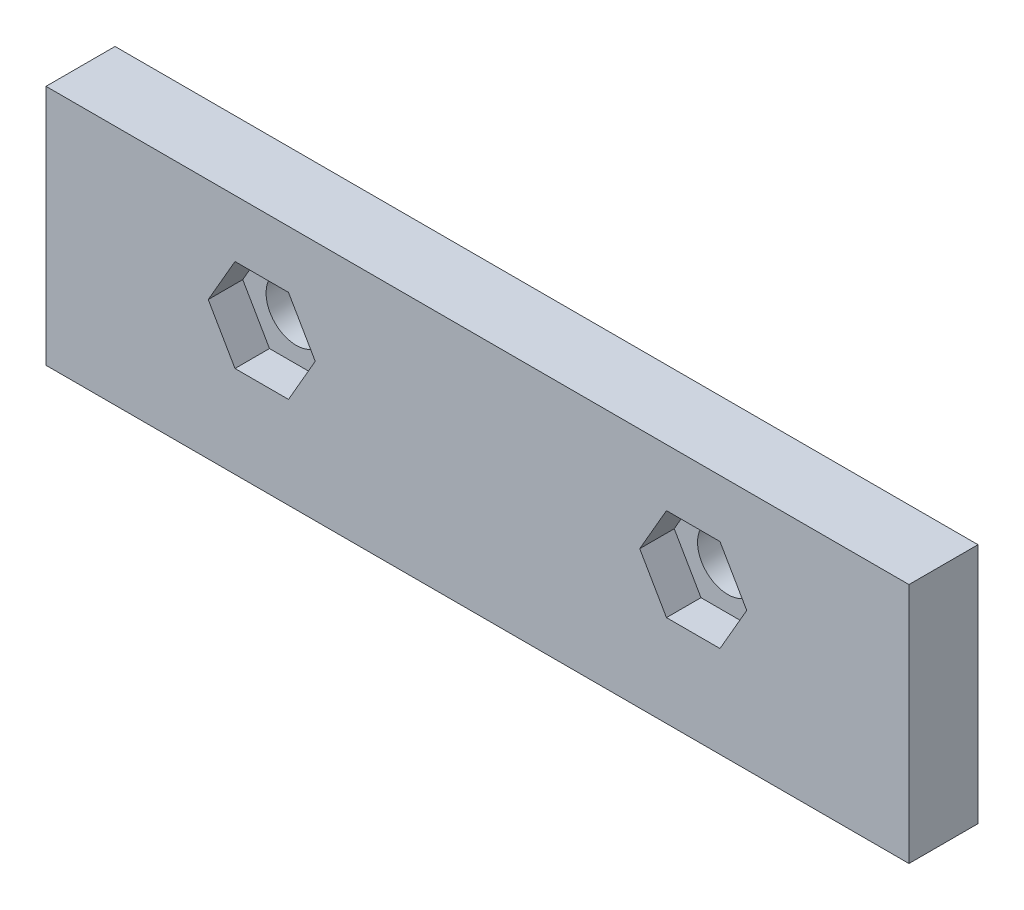
ISO-10303-21;
HEADER;
FILE_DESCRIPTION(('STEP AP214'),'2;1');
FILE_NAME('part.step','',(''),(''),'','','');
FILE_SCHEMA(('AUTOMOTIVE_DESIGN { 1 0 10303 214 1 1 1 1 }'));
ENDSEC;
DATA;
#1=APPLICATION_CONTEXT('core data for automotive mechanical design processes');
#2=APPLICATION_PROTOCOL_DEFINITION('international standard','automotive_design',2000,#1);
#3=PRODUCT_CONTEXT('',#1,'mechanical');
#4=PRODUCT('Part','Part','',(#3));
#5=PRODUCT_RELATED_PRODUCT_CATEGORY('part','',(#4));
#6=PRODUCT_DEFINITION_FORMATION('','',#4);
#7=PRODUCT_DEFINITION_CONTEXT('part definition',#1,'design');
#8=PRODUCT_DEFINITION('design','',#6,#7);
#9=PRODUCT_DEFINITION_SHAPE('','',#8);
#10=(LENGTH_UNIT() NAMED_UNIT(*) SI_UNIT(.MILLI.,.METRE.));
#11=(NAMED_UNIT(*) PLANE_ANGLE_UNIT() SI_UNIT($,.RADIAN.));
#12=(NAMED_UNIT(*) SI_UNIT($,.STERADIAN.) SOLID_ANGLE_UNIT());
#13=UNCERTAINTY_MEASURE_WITH_UNIT(LENGTH_MEASURE(1.E-05),#10,'distance_accuracy_value','');
#14=(GEOMETRIC_REPRESENTATION_CONTEXT(3) GLOBAL_UNCERTAINTY_ASSIGNED_CONTEXT((#13)) GLOBAL_UNIT_ASSIGNED_CONTEXT((#10,
#11,#12)) REPRESENTATION_CONTEXT('',''));
#15=CARTESIAN_POINT('',(0.,0.,0.));
#16=DIRECTION('',(0.,0.,1.));
#17=DIRECTION('',(1.,0.,0.));
#18=AXIS2_PLACEMENT_3D('',#15,#16,#17);
#19=CARTESIAN_POINT('',(12.5,8.,4.));
#20=DIRECTION('',(0.,0.,-1.));
#21=DIRECTION('',(-1.,0.,0.));
#22=AXIS2_PLACEMENT_3D('',#19,#20,#21);
#23=CYLINDRICAL_SURFACE('',#22,1.75);
#24=CARTESIAN_POINT('',(12.5,8.,0.));
#25=DIRECTION('',(0.,0.,1.));
#26=DIRECTION('',(1.,0.,0.));
#27=AXIS2_PLACEMENT_3D('',#24,#25,#26);
#28=CIRCLE('',#27,1.75);
#29=CARTESIAN_POINT('',(14.25,8.,0.));
#30=VERTEX_POINT('',#29);
#31=EDGE_CURVE('E255',#30,#30,#28,.T.);
#32=ORIENTED_EDGE('',*,*,#31,.F.);
#33=EDGE_LOOP('',(#32));
#34=FACE_BOUND('',#33,.T.);
#35=CARTESIAN_POINT('',(12.5,8.,2.));
#36=DIRECTION('',(0.,0.,1.));
#37=DIRECTION('',(1.,0.,0.));
#38=AXIS2_PLACEMENT_3D('',#35,#36,#37);
#39=CIRCLE('',#38,1.75);
#40=CARTESIAN_POINT('',(14.25,8.,2.));
#41=VERTEX_POINT('',#40);
#42=EDGE_CURVE('E40',#41,#41,#39,.T.);
#43=ORIENTED_EDGE('',*,*,#42,.T.);
#44=EDGE_LOOP('',(#43));
#45=FACE_BOUND('',#44,.T.);
#46=ADVANCED_FACE('F36',(#34,#45),#23,.F.);
#47=CARTESIAN_POINT('',(37.5,8.,4.));
#48=DIRECTION('',(0.,0.,-1.));
#49=DIRECTION('',(-1.,0.,0.));
#50=AXIS2_PLACEMENT_3D('',#47,#48,#49);
#51=CYLINDRICAL_SURFACE('',#50,1.75);
#52=CARTESIAN_POINT('',(37.5,8.,0.));
#53=DIRECTION('',(0.,0.,1.));
#54=DIRECTION('',(1.,0.,0.));
#55=AXIS2_PLACEMENT_3D('',#52,#53,#54);
#56=CIRCLE('',#55,1.75);
#57=CARTESIAN_POINT('',(39.25,8.,0.));
#58=VERTEX_POINT('',#57);
#59=EDGE_CURVE('E252',#58,#58,#56,.T.);
#60=ORIENTED_EDGE('',*,*,#59,.F.);
#61=EDGE_LOOP('',(#60));
#62=FACE_BOUND('',#61,.T.);
#63=CARTESIAN_POINT('',(37.5,8.,2.));
#64=DIRECTION('',(0.,0.,1.));
#65=DIRECTION('',(1.,0.,0.));
#66=AXIS2_PLACEMENT_3D('',#63,#64,#65);
#67=CIRCLE('',#66,1.75);
#68=CARTESIAN_POINT('',(39.25,8.,2.));
#69=VERTEX_POINT('',#68);
#70=EDGE_CURVE('E198',#69,#69,#67,.T.);
#71=ORIENTED_EDGE('',*,*,#70,.T.);
#72=EDGE_LOOP('',(#71));
#73=FACE_BOUND('',#72,.T.);
#74=ADVANCED_FACE('F299',(#62,#73),#51,.F.);
#75=CARTESIAN_POINT('',(0.,0.,4.));
#76=DIRECTION('',(0.,0.,-1.));
#77=DIRECTION('',(-1.,0.,0.));
#78=AXIS2_PLACEMENT_3D('',#75,#76,#77);
#79=PLANE('',#78);
#80=DIRECTION('',(0.5,0.866025403784439,0.));
#81=VECTOR('',#80,1.);
#82=CARTESIAN_POINT('',(14.05,5.31532124826824,4.));
#83=LINE('',#82,#81);
#84=CARTESIAN_POINT('',(14.05,5.31532124826824,4.));
#85=VERTEX_POINT('',#84);
#86=CARTESIAN_POINT('',(15.6,7.99999999999999,4.));
#87=VERTEX_POINT('',#86);
#88=EDGE_CURVE('E186',#85,#87,#83,.T.);
#89=ORIENTED_EDGE('',*,*,#88,.F.);
#90=DIRECTION('',(1.,0.,0.));
#91=VECTOR('',#90,1.);
#92=CARTESIAN_POINT('',(10.95,5.31532124826824,4.));
#93=LINE('',#92,#91);
#94=CARTESIAN_POINT('',(10.95,5.31532124826824,4.));
#95=VERTEX_POINT('',#94);
#96=EDGE_CURVE('E53',#95,#85,#93,.T.);
#97=ORIENTED_EDGE('',*,*,#96,.F.);
#98=DIRECTION('',(0.499999999999999,-0.866025403784439,0.));
#99=VECTOR('',#98,1.);
#100=CARTESIAN_POINT('',(9.40000000000001,8.,4.));
#101=LINE('',#100,#99);
#102=CARTESIAN_POINT('',(9.40000000000001,8.,4.));
#103=VERTEX_POINT('',#102);
#104=EDGE_CURVE('E172',#103,#95,#101,.T.);
#105=ORIENTED_EDGE('',*,*,#104,.F.);
#106=DIRECTION('',(-0.5,-0.866025403784439,0.));
#107=VECTOR('',#106,1.);
#108=CARTESIAN_POINT('',(10.95,10.6846787517318,4.));
#109=LINE('',#108,#107);
#110=CARTESIAN_POINT('',(10.95,10.6846787517318,4.));
#111=VERTEX_POINT('',#110);
#112=EDGE_CURVE('E175',#111,#103,#109,.T.);
#113=ORIENTED_EDGE('',*,*,#112,.F.);
#114=DIRECTION('',(-1.,0.,0.));
#115=VECTOR('',#114,1.);
#116=CARTESIAN_POINT('',(14.05,10.6846787517318,4.));
#117=LINE('',#116,#115);
#118=CARTESIAN_POINT('',(14.05,10.6846787517318,4.));
#119=VERTEX_POINT('',#118);
#120=EDGE_CURVE('E191',#119,#111,#117,.T.);
#121=ORIENTED_EDGE('',*,*,#120,.F.);
#122=DIRECTION('',(-0.499999999999999,0.866025403784439,0.));
#123=VECTOR('',#122,1.);
#124=CARTESIAN_POINT('',(15.6,7.99999999999999,4.));
#125=LINE('',#124,#123);
#126=EDGE_CURVE('E188',#87,#119,#125,.T.);
#127=ORIENTED_EDGE('',*,*,#126,.F.);
#128=EDGE_LOOP('',(#89,#97,#105,#113,#121,#127));
#129=FACE_BOUND('',#128,.T.);
#130=DIRECTION('',(0.499999999999999,0.866025403784439,0.));
#131=VECTOR('',#130,1.);
#132=CARTESIAN_POINT('',(39.05,5.31532124826823,4.));
#133=LINE('',#132,#131);
#134=CARTESIAN_POINT('',(39.05,5.31532124826823,4.));
#135=VERTEX_POINT('',#134);
#136=CARTESIAN_POINT('',(40.6,8.00000000000001,4.));
#137=VERTEX_POINT('',#136);
#138=EDGE_CURVE('E232',#135,#137,#133,.T.);
#139=ORIENTED_EDGE('',*,*,#138,.F.);
#140=DIRECTION('',(1.,0.,0.));
#141=VECTOR('',#140,1.);
#142=CARTESIAN_POINT('',(35.95,5.31532124826823,4.));
#143=LINE('',#142,#141);
#144=CARTESIAN_POINT('',(35.95,5.31532124826823,4.));
#145=VERTEX_POINT('',#144);
#146=EDGE_CURVE('E61',#145,#135,#143,.T.);
#147=ORIENTED_EDGE('',*,*,#146,.F.);
#148=DIRECTION('',(0.5,-0.866025403784439,0.));
#149=VECTOR('',#148,1.);
#150=CARTESIAN_POINT('',(34.4,8.,4.));
#151=LINE('',#150,#149);
#152=CARTESIAN_POINT('',(34.4,8.,4.));
#153=VERTEX_POINT('',#152);
#154=EDGE_CURVE('E219',#153,#145,#151,.T.);
#155=ORIENTED_EDGE('',*,*,#154,.F.);
#156=DIRECTION('',(-0.499999999999999,-0.866025403784439,0.));
#157=VECTOR('',#156,1.);
#158=CARTESIAN_POINT('',(35.95,10.6846787517318,4.));
#159=LINE('',#158,#157);
#160=CARTESIAN_POINT('',(35.95,10.6846787517318,4.));
#161=VERTEX_POINT('',#160);
#162=EDGE_CURVE('E222',#161,#153,#159,.T.);
#163=ORIENTED_EDGE('',*,*,#162,.F.);
#164=DIRECTION('',(-1.,0.,0.));
#165=VECTOR('',#164,1.);
#166=CARTESIAN_POINT('',(39.05,10.6846787517318,4.));
#167=LINE('',#166,#165);
#168=CARTESIAN_POINT('',(39.05,10.6846787517318,4.));
#169=VERTEX_POINT('',#168);
#170=EDGE_CURVE('E226',#169,#161,#167,.T.);
#171=ORIENTED_EDGE('',*,*,#170,.F.);
#172=DIRECTION('',(-0.5,0.866025403784439,0.));
#173=VECTOR('',#172,1.);
#174=CARTESIAN_POINT('',(40.6,8.00000000000001,4.));
#175=LINE('',#174,#173);
#176=EDGE_CURVE('E229',#137,#169,#175,.T.);
#177=ORIENTED_EDGE('',*,*,#176,.F.);
#178=EDGE_LOOP('',(#139,#147,#155,#163,#171,#177));
#179=FACE_BOUND('',#178,.T.);
#180=DIRECTION('',(0.,-1.,0.));
#181=VECTOR('',#180,1.);
#182=CARTESIAN_POINT('',(0.,0.,4.));
#183=LINE('',#182,#181);
#184=CARTESIAN_POINT('',(0.,14.,4.));
#185=VERTEX_POINT('',#184);
#186=CARTESIAN_POINT('',(0.,0.,4.));
#187=VERTEX_POINT('',#186);
#188=EDGE_CURVE('E259',#185,#187,#183,.T.);
#189=ORIENTED_EDGE('',*,*,#188,.T.);
#190=DIRECTION('',(1.,0.,0.));
#191=VECTOR('',#190,1.);
#192=CARTESIAN_POINT('',(0.,0.,4.));
#193=LINE('',#192,#191);
#194=CARTESIAN_POINT('',(50.,0.,4.));
#195=VERTEX_POINT('',#194);
#196=EDGE_CURVE('E262',#187,#195,#193,.T.);
#197=ORIENTED_EDGE('',*,*,#196,.T.);
#198=DIRECTION('',(0.,1.,0.));
#199=VECTOR('',#198,1.);
#200=CARTESIAN_POINT('',(50.,0.,4.));
#201=LINE('',#200,#199);
#202=CARTESIAN_POINT('',(50.,14.,4.));
#203=VERTEX_POINT('',#202);
#204=EDGE_CURVE('E265',#195,#203,#201,.T.);
#205=ORIENTED_EDGE('',*,*,#204,.T.);
#206=DIRECTION('',(-1.,0.,0.));
#207=VECTOR('',#206,1.);
#208=CARTESIAN_POINT('',(0.,14.,4.));
#209=LINE('',#208,#207);
#210=EDGE_CURVE('E267',#203,#185,#209,.T.);
#211=ORIENTED_EDGE('',*,*,#210,.T.);
#212=EDGE_LOOP('',(#189,#197,#205,#211));
#213=FACE_BOUND('',#212,.T.);
#214=ADVANCED_FACE('F305',(#129,#179,#213),#79,.F.);
#215=CARTESIAN_POINT('',(0.,0.,0.));
#216=DIRECTION('',(0.,0.,-1.));
#217=DIRECTION('',(-1.,0.,0.));
#218=AXIS2_PLACEMENT_3D('',#215,#216,#217);
#219=PLANE('',#218);
#220=ORIENTED_EDGE('',*,*,#31,.T.);
#221=EDGE_LOOP('',(#220));
#222=FACE_BOUND('',#221,.T.);
#223=DIRECTION('',(0.,-1.,0.));
#224=VECTOR('',#223,1.);
#225=CARTESIAN_POINT('',(0.,0.,0.));
#226=LINE('',#225,#224);
#227=CARTESIAN_POINT('',(0.,14.,0.));
#228=VERTEX_POINT('',#227);
#229=CARTESIAN_POINT('',(0.,0.,0.));
#230=VERTEX_POINT('',#229);
#231=EDGE_CURVE('E258',#228,#230,#226,.T.);
#232=ORIENTED_EDGE('',*,*,#231,.F.);
#233=DIRECTION('',(-1.,0.,0.));
#234=VECTOR('',#233,1.);
#235=CARTESIAN_POINT('',(0.,14.,0.));
#236=LINE('',#235,#234);
#237=CARTESIAN_POINT('',(50.,14.,0.));
#238=VERTEX_POINT('',#237);
#239=EDGE_CURVE('E263',#238,#228,#236,.T.);
#240=ORIENTED_EDGE('',*,*,#239,.F.);
#241=DIRECTION('',(0.,1.,0.));
#242=VECTOR('',#241,1.);
#243=CARTESIAN_POINT('',(50.,0.,0.));
#244=LINE('',#243,#242);
#245=CARTESIAN_POINT('',(50.,0.,0.));
#246=VERTEX_POINT('',#245);
#247=EDGE_CURVE('E274',#246,#238,#244,.T.);
#248=ORIENTED_EDGE('',*,*,#247,.F.);
#249=DIRECTION('',(1.,0.,0.));
#250=VECTOR('',#249,1.);
#251=CARTESIAN_POINT('',(0.,0.,0.));
#252=LINE('',#251,#250);
#253=EDGE_CURVE('E272',#230,#246,#252,.T.);
#254=ORIENTED_EDGE('',*,*,#253,.F.);
#255=EDGE_LOOP('',(#232,#240,#248,#254));
#256=FACE_BOUND('',#255,.T.);
#257=ORIENTED_EDGE('',*,*,#59,.T.);
#258=EDGE_LOOP('',(#257));
#259=FACE_BOUND('',#258,.T.);
#260=ADVANCED_FACE('F313',(#222,#256,#259),#219,.T.);
#261=CARTESIAN_POINT('',(0.,0.,4.));
#262=DIRECTION('',(1.,0.,0.));
#263=DIRECTION('',(0.,0.,-1.));
#264=AXIS2_PLACEMENT_3D('',#261,#262,#263);
#265=PLANE('',#264);
#266=ORIENTED_EDGE('',*,*,#231,.T.);
#267=DIRECTION('',(0.,0.,-1.));
#268=VECTOR('',#267,1.);
#269=CARTESIAN_POINT('',(0.,0.,4.));
#270=LINE('',#269,#268);
#271=EDGE_CURVE('E11',#187,#230,#270,.T.);
#272=ORIENTED_EDGE('',*,*,#271,.F.);
#273=ORIENTED_EDGE('',*,*,#188,.F.);
#274=DIRECTION('',(0.,0.,-1.));
#275=VECTOR('',#274,1.);
#276=CARTESIAN_POINT('',(0.,14.,4.));
#277=LINE('',#276,#275);
#278=EDGE_CURVE('E269',#185,#228,#277,.T.);
#279=ORIENTED_EDGE('',*,*,#278,.T.);
#280=EDGE_LOOP('',(#266,#272,#273,#279));
#281=FACE_BOUND('',#280,.T.);
#282=ADVANCED_FACE('F38',(#281),#265,.F.);
#283=CARTESIAN_POINT('',(0.,0.,4.));
#284=DIRECTION('',(0.,1.,0.));
#285=DIRECTION('',(0.,0.,1.));
#286=AXIS2_PLACEMENT_3D('',#283,#284,#285);
#287=PLANE('',#286);
#288=ORIENTED_EDGE('',*,*,#253,.T.);
#289=DIRECTION('',(0.,0.,-1.));
#290=VECTOR('',#289,1.);
#291=CARTESIAN_POINT('',(50.,0.,4.));
#292=LINE('',#291,#290);
#293=EDGE_CURVE('E45',#195,#246,#292,.T.);
#294=ORIENTED_EDGE('',*,*,#293,.F.);
#295=ORIENTED_EDGE('',*,*,#196,.F.);
#296=ORIENTED_EDGE('',*,*,#271,.T.);
#297=EDGE_LOOP('',(#288,#294,#295,#296));
#298=FACE_BOUND('',#297,.T.);
#299=ADVANCED_FACE('F325',(#298),#287,.F.);
#300=CARTESIAN_POINT('',(50.,0.,4.));
#301=DIRECTION('',(-1.,0.,0.));
#302=DIRECTION('',(0.,0.,1.));
#303=AXIS2_PLACEMENT_3D('',#300,#301,#302);
#304=PLANE('',#303);
#305=ORIENTED_EDGE('',*,*,#247,.T.);
#306=DIRECTION('',(0.,0.,-1.));
#307=VECTOR('',#306,1.);
#308=CARTESIAN_POINT('',(50.,14.,4.));
#309=LINE('',#308,#307);
#310=EDGE_CURVE('E279',#203,#238,#309,.T.);
#311=ORIENTED_EDGE('',*,*,#310,.F.);
#312=ORIENTED_EDGE('',*,*,#204,.F.);
#313=ORIENTED_EDGE('',*,*,#293,.T.);
#314=EDGE_LOOP('',(#305,#311,#312,#313));
#315=FACE_BOUND('',#314,.T.);
#316=ADVANCED_FACE('F322',(#315),#304,.F.);
#317=CARTESIAN_POINT('',(0.,14.,4.));
#318=DIRECTION('',(0.,-1.,0.));
#319=DIRECTION('',(0.,0.,-1.));
#320=AXIS2_PLACEMENT_3D('',#317,#318,#319);
#321=PLANE('',#320);
#322=ORIENTED_EDGE('',*,*,#239,.T.);
#323=ORIENTED_EDGE('',*,*,#278,.F.);
#324=ORIENTED_EDGE('',*,*,#210,.F.);
#325=ORIENTED_EDGE('',*,*,#310,.T.);
#326=EDGE_LOOP('',(#322,#323,#324,#325));
#327=FACE_BOUND('',#326,.T.);
#328=ADVANCED_FACE('F318',(#327),#321,.F.);
#329=CARTESIAN_POINT('',(35.95,5.31532124826823,2.));
#330=DIRECTION('',(0.,-1.,0.));
#331=DIRECTION('',(1.,0.,0.));
#332=AXIS2_PLACEMENT_3D('',#329,#330,#331);
#333=PLANE('',#332);
#334=ORIENTED_EDGE('',*,*,#146,.T.);
#335=DIRECTION('',(0.,0.,1.));
#336=VECTOR('',#335,1.);
#337=CARTESIAN_POINT('',(39.05,5.31532124826823,2.));
#338=LINE('',#337,#336);
#339=CARTESIAN_POINT('',(39.05,5.31532124826823,2.));
#340=VERTEX_POINT('',#339);
#341=EDGE_CURVE('E206',#340,#135,#338,.T.);
#342=ORIENTED_EDGE('',*,*,#341,.F.);
#343=DIRECTION('',(1.,0.,0.));
#344=VECTOR('',#343,1.);
#345=CARTESIAN_POINT('',(35.95,5.31532124826823,2.));
#346=LINE('',#345,#344);
#347=CARTESIAN_POINT('',(35.95,5.31532124826823,2.));
#348=VERTEX_POINT('',#347);
#349=EDGE_CURVE('E223',#348,#340,#346,.T.);
#350=ORIENTED_EDGE('',*,*,#349,.F.);
#351=DIRECTION('',(0.,0.,1.));
#352=VECTOR('',#351,1.);
#353=CARTESIAN_POINT('',(35.95,5.31532124826823,2.));
#354=LINE('',#353,#352);
#355=EDGE_CURVE('E217',#348,#145,#354,.T.);
#356=ORIENTED_EDGE('',*,*,#355,.T.);
#357=EDGE_LOOP('',(#334,#342,#350,#356));
#358=FACE_BOUND('',#357,.T.);
#359=ADVANCED_FACE('F321',(#358),#333,.F.);
#360=CARTESIAN_POINT('',(34.4,8.,2.));
#361=DIRECTION('',(-0.866025403784439,-0.5,0.));
#362=DIRECTION('',(0.5,-0.866025403784439,0.));
#363=AXIS2_PLACEMENT_3D('',#360,#361,#362);
#364=PLANE('',#363);
#365=ORIENTED_EDGE('',*,*,#154,.T.);
#366=ORIENTED_EDGE('',*,*,#355,.F.);
#367=DIRECTION('',(0.5,-0.866025403784439,0.));
#368=VECTOR('',#367,1.);
#369=CARTESIAN_POINT('',(34.4,8.,2.));
#370=LINE('',#369,#368);
#371=CARTESIAN_POINT('',(34.4,8.,2.));
#372=VERTEX_POINT('',#371);
#373=EDGE_CURVE('E208',#372,#348,#370,.T.);
#374=ORIENTED_EDGE('',*,*,#373,.F.);
#375=DIRECTION('',(0.,0.,1.));
#376=VECTOR('',#375,1.);
#377=CARTESIAN_POINT('',(34.4,8.,2.));
#378=LINE('',#377,#376);
#379=EDGE_CURVE('E215',#372,#153,#378,.T.);
#380=ORIENTED_EDGE('',*,*,#379,.T.);
#381=EDGE_LOOP('',(#365,#366,#374,#380));
#382=FACE_BOUND('',#381,.T.);
#383=ADVANCED_FACE('F408',(#382),#364,.F.);
#384=CARTESIAN_POINT('',(35.95,10.6846787517318,2.));
#385=DIRECTION('',(-0.866025403784439,0.499999999999999,0.));
#386=DIRECTION('',(-0.499999999999999,-0.866025403784439,0.));
#387=AXIS2_PLACEMENT_3D('',#384,#385,#386);
#388=PLANE('',#387);
#389=ORIENTED_EDGE('',*,*,#162,.T.);
#390=ORIENTED_EDGE('',*,*,#379,.F.);
#391=DIRECTION('',(-0.499999999999999,-0.866025403784439,0.));
#392=VECTOR('',#391,1.);
#393=CARTESIAN_POINT('',(35.95,10.6846787517318,2.));
#394=LINE('',#393,#392);
#395=CARTESIAN_POINT('',(35.95,10.6846787517318,2.));
#396=VERTEX_POINT('',#395);
#397=EDGE_CURVE('E238',#396,#372,#394,.T.);
#398=ORIENTED_EDGE('',*,*,#397,.F.);
#399=DIRECTION('',(0.,0.,1.));
#400=VECTOR('',#399,1.);
#401=CARTESIAN_POINT('',(35.95,10.6846787517318,2.));
#402=LINE('',#401,#400);
#403=EDGE_CURVE('E213',#396,#161,#402,.T.);
#404=ORIENTED_EDGE('',*,*,#403,.T.);
#405=EDGE_LOOP('',(#389,#390,#398,#404));
#406=FACE_BOUND('',#405,.T.);
#407=ADVANCED_FACE('F415',(#406),#388,.F.);
#408=CARTESIAN_POINT('',(39.05,10.6846787517318,2.));
#409=DIRECTION('',(0.,1.,0.));
#410=DIRECTION('',(0.,0.,1.));
#411=AXIS2_PLACEMENT_3D('',#408,#409,#410);
#412=PLANE('',#411);
#413=ORIENTED_EDGE('',*,*,#170,.T.);
#414=ORIENTED_EDGE('',*,*,#403,.F.);
#415=DIRECTION('',(-1.,0.,0.));
#416=VECTOR('',#415,1.);
#417=CARTESIAN_POINT('',(39.05,10.6846787517318,2.));
#418=LINE('',#417,#416);
#419=CARTESIAN_POINT('',(39.05,10.6846787517318,2.));
#420=VERTEX_POINT('',#419);
#421=EDGE_CURVE('E241',#420,#396,#418,.T.);
#422=ORIENTED_EDGE('',*,*,#421,.F.);
#423=DIRECTION('',(0.,0.,1.));
#424=VECTOR('',#423,1.);
#425=CARTESIAN_POINT('',(39.05,10.6846787517318,2.));
#426=LINE('',#425,#424);
#427=EDGE_CURVE('E211',#420,#169,#426,.T.);
#428=ORIENTED_EDGE('',*,*,#427,.T.);
#429=EDGE_LOOP('',(#413,#414,#422,#428));
#430=FACE_BOUND('',#429,.T.);
#431=ADVANCED_FACE('F423',(#430),#412,.F.);
#432=CARTESIAN_POINT('',(40.6,8.00000000000001,2.));
#433=DIRECTION('',(0.866025403784439,0.5,0.));
#434=DIRECTION('',(-0.5,0.866025403784439,0.));
#435=AXIS2_PLACEMENT_3D('',#432,#433,#434);
#436=PLANE('',#435);
#437=ORIENTED_EDGE('',*,*,#176,.T.);
#438=ORIENTED_EDGE('',*,*,#427,.F.);
#439=DIRECTION('',(-0.5,0.866025403784439,0.));
#440=VECTOR('',#439,1.);
#441=CARTESIAN_POINT('',(40.6,8.00000000000001,2.));
#442=LINE('',#441,#440);
#443=CARTESIAN_POINT('',(40.6,8.00000000000001,2.));
#444=VERTEX_POINT('',#443);
#445=EDGE_CURVE('E244',#444,#420,#442,.T.);
#446=ORIENTED_EDGE('',*,*,#445,.F.);
#447=DIRECTION('',(0.,0.,1.));
#448=VECTOR('',#447,1.);
#449=CARTESIAN_POINT('',(40.6,8.00000000000001,2.));
#450=LINE('',#449,#448);
#451=EDGE_CURVE('E209',#444,#137,#450,.T.);
#452=ORIENTED_EDGE('',*,*,#451,.T.);
#453=EDGE_LOOP('',(#437,#438,#446,#452));
#454=FACE_BOUND('',#453,.T.);
#455=ADVANCED_FACE('F431',(#454),#436,.F.);
#456=CARTESIAN_POINT('',(39.05,5.31532124826823,2.));
#457=DIRECTION('',(0.866025403784439,-0.499999999999999,0.));
#458=DIRECTION('',(0.499999999999999,0.866025403784439,0.));
#459=AXIS2_PLACEMENT_3D('',#456,#457,#458);
#460=PLANE('',#459);
#461=ORIENTED_EDGE('',*,*,#138,.T.);
#462=ORIENTED_EDGE('',*,*,#451,.F.);
#463=DIRECTION('',(0.499999999999999,0.866025403784439,0.));
#464=VECTOR('',#463,1.);
#465=CARTESIAN_POINT('',(39.05,5.31532124826823,2.));
#466=LINE('',#465,#464);
#467=EDGE_CURVE('E247',#340,#444,#466,.T.);
#468=ORIENTED_EDGE('',*,*,#467,.F.);
#469=ORIENTED_EDGE('',*,*,#341,.T.);
#470=EDGE_LOOP('',(#461,#462,#468,#469));
#471=FACE_BOUND('',#470,.T.);
#472=ADVANCED_FACE('F439',(#471),#460,.F.);
#473=CARTESIAN_POINT('',(0.,0.,2.));
#474=DIRECTION('',(0.,0.,1.));
#475=DIRECTION('',(1.,0.,0.));
#476=AXIS2_PLACEMENT_3D('',#473,#474,#475);
#477=PLANE('',#476);
#478=ORIENTED_EDGE('',*,*,#70,.F.);
#479=EDGE_LOOP('',(#478));
#480=FACE_BOUND('',#479,.T.);
#481=ORIENTED_EDGE('',*,*,#349,.T.);
#482=ORIENTED_EDGE('',*,*,#467,.T.);
#483=ORIENTED_EDGE('',*,*,#445,.T.);
#484=ORIENTED_EDGE('',*,*,#421,.T.);
#485=ORIENTED_EDGE('',*,*,#397,.T.);
#486=ORIENTED_EDGE('',*,*,#373,.T.);
#487=EDGE_LOOP('',(#481,#482,#483,#484,#485,#486));
#488=FACE_BOUND('',#487,.T.);
#489=ADVANCED_FACE('F447',(#480,#488),#477,.T.);
#490=CARTESIAN_POINT('',(10.95,5.31532124826824,2.));
#491=DIRECTION('',(0.,-1.,0.));
#492=DIRECTION('',(0.,0.,-1.));
#493=AXIS2_PLACEMENT_3D('',#490,#491,#492);
#494=PLANE('',#493);
#495=ORIENTED_EDGE('',*,*,#96,.T.);
#496=DIRECTION('',(0.,0.,1.));
#497=VECTOR('',#496,1.);
#498=CARTESIAN_POINT('',(14.05,5.31532124826824,2.));
#499=LINE('',#498,#497);
#500=CARTESIAN_POINT('',(14.05,5.31532124826824,2.));
#501=VERTEX_POINT('',#500);
#502=EDGE_CURVE('E149',#501,#85,#499,.T.);
#503=ORIENTED_EDGE('',*,*,#502,.F.);
#504=DIRECTION('',(1.,0.,0.));
#505=VECTOR('',#504,1.);
#506=CARTESIAN_POINT('',(10.95,5.31532124826824,2.));
#507=LINE('',#506,#505);
#508=CARTESIAN_POINT('',(10.95,5.31532124826824,2.));
#509=VERTEX_POINT('',#508);
#510=EDGE_CURVE('E153',#509,#501,#507,.T.);
#511=ORIENTED_EDGE('',*,*,#510,.F.);
#512=DIRECTION('',(0.,0.,1.));
#513=VECTOR('',#512,1.);
#514=CARTESIAN_POINT('',(10.95,5.31532124826824,2.));
#515=LINE('',#514,#513);
#516=EDGE_CURVE('E196',#509,#95,#515,.T.);
#517=ORIENTED_EDGE('',*,*,#516,.T.);
#518=EDGE_LOOP('',(#495,#503,#511,#517));
#519=FACE_BOUND('',#518,.T.);
#520=ADVANCED_FACE('F151',(#519),#494,.F.);
#521=CARTESIAN_POINT('',(9.40000000000001,8.,2.));
#522=DIRECTION('',(-0.866025403784439,-0.5,0.));
#523=DIRECTION('',(0.499999999999999,-0.866025403784439,0.));
#524=AXIS2_PLACEMENT_3D('',#521,#522,#523);
#525=PLANE('',#524);
#526=ORIENTED_EDGE('',*,*,#104,.T.);
#527=ORIENTED_EDGE('',*,*,#516,.F.);
#528=DIRECTION('',(0.499999999999999,-0.866025403784439,0.));
#529=VECTOR('',#528,1.);
#530=CARTESIAN_POINT('',(9.40000000000001,8.,2.));
#531=LINE('',#530,#529);
#532=CARTESIAN_POINT('',(9.40000000000001,8.,2.));
#533=VERTEX_POINT('',#532);
#534=EDGE_CURVE('E159',#533,#509,#531,.T.);
#535=ORIENTED_EDGE('',*,*,#534,.F.);
#536=DIRECTION('',(0.,0.,1.));
#537=VECTOR('',#536,1.);
#538=CARTESIAN_POINT('',(9.40000000000001,8.,2.));
#539=LINE('',#538,#537);
#540=EDGE_CURVE('E199',#533,#103,#539,.T.);
#541=ORIENTED_EDGE('',*,*,#540,.T.);
#542=EDGE_LOOP('',(#526,#527,#535,#541));
#543=FACE_BOUND('',#542,.T.);
#544=ADVANCED_FACE('F461',(#543),#525,.F.);
#545=CARTESIAN_POINT('',(10.95,10.6846787517318,2.));
#546=DIRECTION('',(-0.866025403784439,0.5,0.));
#547=DIRECTION('',(-0.5,-0.866025403784439,0.));
#548=AXIS2_PLACEMENT_3D('',#545,#546,#547);
#549=PLANE('',#548);
#550=ORIENTED_EDGE('',*,*,#112,.T.);
#551=ORIENTED_EDGE('',*,*,#540,.F.);
#552=DIRECTION('',(-0.5,-0.866025403784439,0.));
#553=VECTOR('',#552,1.);
#554=CARTESIAN_POINT('',(10.95,10.6846787517318,2.));
#555=LINE('',#554,#553);
#556=CARTESIAN_POINT('',(10.95,10.6846787517318,2.));
#557=VERTEX_POINT('',#556);
#558=EDGE_CURVE('E182',#557,#533,#555,.T.);
#559=ORIENTED_EDGE('',*,*,#558,.F.);
#560=DIRECTION('',(0.,0.,1.));
#561=VECTOR('',#560,1.);
#562=CARTESIAN_POINT('',(10.95,10.6846787517318,2.));
#563=LINE('',#562,#561);
#564=EDGE_CURVE('E201',#557,#111,#563,.T.);
#565=ORIENTED_EDGE('',*,*,#564,.T.);
#566=EDGE_LOOP('',(#550,#551,#559,#565));
#567=FACE_BOUND('',#566,.T.);
#568=ADVANCED_FACE('F468',(#567),#549,.F.);
#569=CARTESIAN_POINT('',(14.05,10.6846787517318,2.));
#570=DIRECTION('',(0.,1.,0.));
#571=DIRECTION('',(0.,0.,1.));
#572=AXIS2_PLACEMENT_3D('',#569,#570,#571);
#573=PLANE('',#572);
#574=ORIENTED_EDGE('',*,*,#120,.T.);
#575=ORIENTED_EDGE('',*,*,#564,.F.);
#576=DIRECTION('',(-1.,0.,0.));
#577=VECTOR('',#576,1.);
#578=CARTESIAN_POINT('',(14.05,10.6846787517318,2.));
#579=LINE('',#578,#577);
#580=CARTESIAN_POINT('',(14.05,10.6846787517318,2.));
#581=VERTEX_POINT('',#580);
#582=EDGE_CURVE('E179',#581,#557,#579,.T.);
#583=ORIENTED_EDGE('',*,*,#582,.F.);
#584=DIRECTION('',(0.,0.,1.));
#585=VECTOR('',#584,1.);
#586=CARTESIAN_POINT('',(14.05,10.6846787517318,2.));
#587=LINE('',#586,#585);
#588=EDGE_CURVE('E203',#581,#119,#587,.T.);
#589=ORIENTED_EDGE('',*,*,#588,.T.);
#590=EDGE_LOOP('',(#574,#575,#583,#589));
#591=FACE_BOUND('',#590,.T.);
#592=ADVANCED_FACE('F475',(#591),#573,.F.);
#593=CARTESIAN_POINT('',(15.6,7.99999999999999,2.));
#594=DIRECTION('',(0.866025403784439,0.499999999999999,0.));
#595=DIRECTION('',(-0.499999999999999,0.866025403784439,0.));
#596=AXIS2_PLACEMENT_3D('',#593,#594,#595);
#597=PLANE('',#596);
#598=ORIENTED_EDGE('',*,*,#126,.T.);
#599=ORIENTED_EDGE('',*,*,#588,.F.);
#600=DIRECTION('',(-0.499999999999999,0.866025403784439,0.));
#601=VECTOR('',#600,1.);
#602=CARTESIAN_POINT('',(15.6,7.99999999999999,2.));
#603=LINE('',#602,#601);
#604=CARTESIAN_POINT('',(15.6,7.99999999999999,2.));
#605=VERTEX_POINT('',#604);
#606=EDGE_CURVE('E167',#605,#581,#603,.T.);
#607=ORIENTED_EDGE('',*,*,#606,.F.);
#608=DIRECTION('',(0.,0.,1.));
#609=VECTOR('',#608,1.);
#610=CARTESIAN_POINT('',(15.6,7.99999999999999,2.));
#611=LINE('',#610,#609);
#612=EDGE_CURVE('E158',#605,#87,#611,.T.);
#613=ORIENTED_EDGE('',*,*,#612,.T.);
#614=EDGE_LOOP('',(#598,#599,#607,#613));
#615=FACE_BOUND('',#614,.T.);
#616=ADVANCED_FACE('F295',(#615),#597,.F.);
#617=CARTESIAN_POINT('',(14.05,5.31532124826824,2.));
#618=DIRECTION('',(0.866025403784439,-0.5,0.));
#619=DIRECTION('',(0.5,0.866025403784439,0.));
#620=AXIS2_PLACEMENT_3D('',#617,#618,#619);
#621=PLANE('',#620);
#622=ORIENTED_EDGE('',*,*,#88,.T.);
#623=ORIENTED_EDGE('',*,*,#612,.F.);
#624=DIRECTION('',(0.5,0.866025403784439,0.));
#625=VECTOR('',#624,1.);
#626=CARTESIAN_POINT('',(14.05,5.31532124826824,2.));
#627=LINE('',#626,#625);
#628=EDGE_CURVE('E162',#501,#605,#627,.T.);
#629=ORIENTED_EDGE('',*,*,#628,.F.);
#630=ORIENTED_EDGE('',*,*,#502,.T.);
#631=EDGE_LOOP('',(#622,#623,#629,#630));
#632=FACE_BOUND('',#631,.T.);
#633=ADVANCED_FACE('F163',(#632),#621,.F.);
#634=CARTESIAN_POINT('',(0.,0.,2.));
#635=DIRECTION('',(0.,0.,1.));
#636=DIRECTION('',(1.,0.,0.));
#637=AXIS2_PLACEMENT_3D('',#634,#635,#636);
#638=PLANE('',#637);
#639=ORIENTED_EDGE('',*,*,#42,.F.);
#640=EDGE_LOOP('',(#639));
#641=FACE_BOUND('',#640,.T.);
#642=ORIENTED_EDGE('',*,*,#510,.T.);
#643=ORIENTED_EDGE('',*,*,#628,.T.);
#644=ORIENTED_EDGE('',*,*,#606,.T.);
#645=ORIENTED_EDGE('',*,*,#582,.T.);
#646=ORIENTED_EDGE('',*,*,#558,.T.);
#647=ORIENTED_EDGE('',*,*,#534,.T.);
#648=EDGE_LOOP('',(#642,#643,#644,#645,#646,#647));
#649=FACE_BOUND('',#648,.T.);
#650=ADVANCED_FACE('F169',(#641,#649),#638,.T.);
#651=CLOSED_SHELL('',(#46,#74,#214,#260,#282,#299,#316,#328,#359,#383,#407,#431,#455,#472,#489,
#520,#544,#568,#592,#616,#633,#650));
#652=MANIFOLD_SOLID_BREP('B2',#651);
#653=ADVANCED_BREP_SHAPE_REPRESENTATION('',(#18,#652),#14);
#654=SHAPE_DEFINITION_REPRESENTATION(#9,#653);
ENDSEC;
END-ISO-10303-21;
